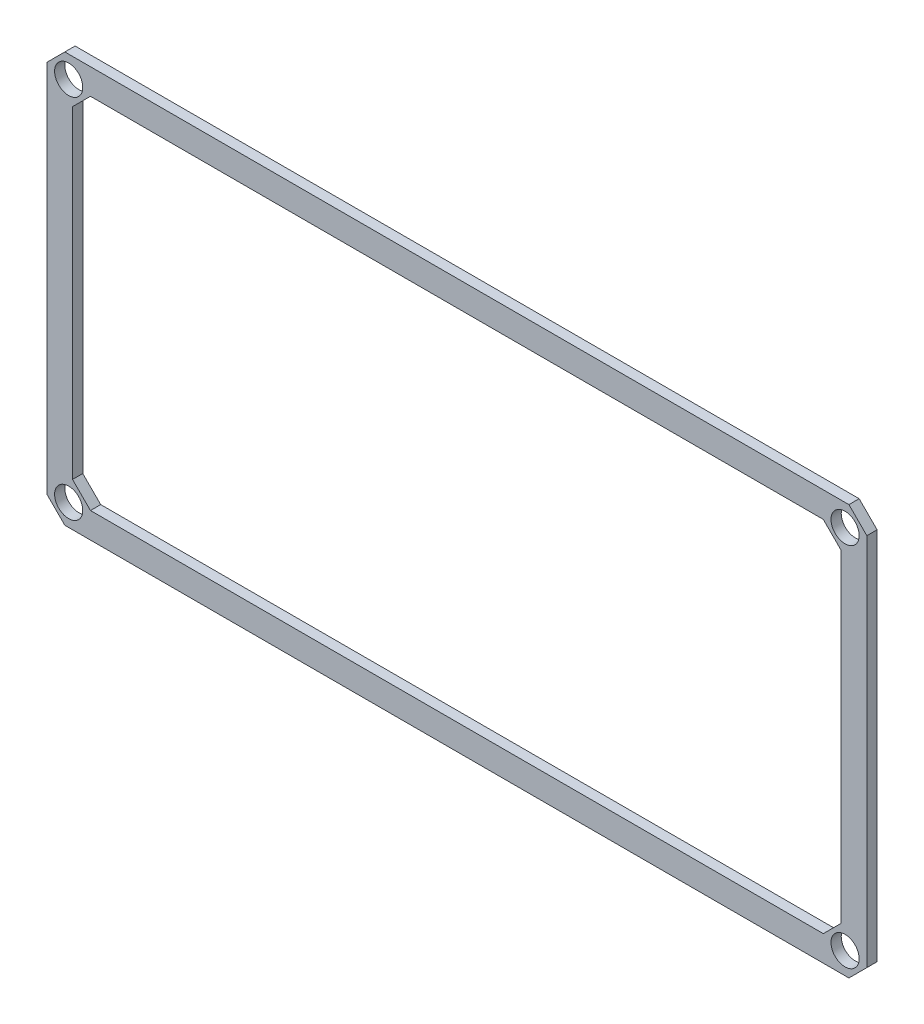
ISO-10303-21;
HEADER;
FILE_DESCRIPTION(('STEP AP214'),'2;1');
FILE_NAME('part.step','',(''),(''),'','','');
FILE_SCHEMA(('AUTOMOTIVE_DESIGN { 1 0 10303 214 1 1 1 1 }'));
ENDSEC;
DATA;
#1=APPLICATION_CONTEXT('core data for automotive mechanical design processes');
#2=APPLICATION_PROTOCOL_DEFINITION('international standard','automotive_design',2000,#1);
#3=PRODUCT_CONTEXT('',#1,'mechanical');
#4=PRODUCT('Part','Part','',(#3));
#5=PRODUCT_RELATED_PRODUCT_CATEGORY('part','',(#4));
#6=PRODUCT_DEFINITION_FORMATION('','',#4);
#7=PRODUCT_DEFINITION_CONTEXT('part definition',#1,'design');
#8=PRODUCT_DEFINITION('design','',#6,#7);
#9=PRODUCT_DEFINITION_SHAPE('','',#8);
#10=(LENGTH_UNIT() NAMED_UNIT(*) SI_UNIT(.MILLI.,.METRE.));
#11=(NAMED_UNIT(*) PLANE_ANGLE_UNIT() SI_UNIT($,.RADIAN.));
#12=(NAMED_UNIT(*) SI_UNIT($,.STERADIAN.) SOLID_ANGLE_UNIT());
#13=UNCERTAINTY_MEASURE_WITH_UNIT(LENGTH_MEASURE(1.E-05),#10,'distance_accuracy_value','');
#14=(GEOMETRIC_REPRESENTATION_CONTEXT(3) GLOBAL_UNCERTAINTY_ASSIGNED_CONTEXT((#13)) GLOBAL_UNIT_ASSIGNED_CONTEXT((#10,
#11,#12)) REPRESENTATION_CONTEXT('',''));
#15=CARTESIAN_POINT('',(0.,0.,0.));
#16=DIRECTION('',(0.,0.,1.));
#17=DIRECTION('',(1.,0.,0.));
#18=AXIS2_PLACEMENT_3D('',#15,#16,#17);
#19=CARTESIAN_POINT('',(0.,0.,2.));
#20=DIRECTION('',(0.,0.,-1.));
#21=DIRECTION('',(-1.,0.,0.));
#22=AXIS2_PLACEMENT_3D('',#19,#20,#21);
#23=PLANE('',#22);
#24=CARTESIAN_POINT('',(75.75,35.75,2.));
#25=DIRECTION('',(0.,0.,-1.));
#26=DIRECTION('',(-1.,0.,0.));
#27=AXIS2_PLACEMENT_3D('',#24,#25,#26);
#28=CIRCLE('',#27,2.75);
#29=CARTESIAN_POINT('',(73.,35.75,2.));
#30=VERTEX_POINT('',#29);
#31=EDGE_CURVE('E474',#30,#30,#28,.T.);
#32=ORIENTED_EDGE('',*,*,#31,.T.);
#33=EDGE_LOOP('',(#32));
#34=FACE_BOUND('',#33,.T.);
#35=CARTESIAN_POINT('',(-75.75,-35.75,2.));
#36=DIRECTION('',(0.,0.,-1.));
#37=DIRECTION('',(-1.,0.,0.));
#38=AXIS2_PLACEMENT_3D('',#35,#36,#37);
#39=CIRCLE('',#38,2.75);
#40=CARTESIAN_POINT('',(-78.5,-35.75,2.));
#41=VERTEX_POINT('',#40);
#42=EDGE_CURVE('E487',#41,#41,#39,.T.);
#43=ORIENTED_EDGE('',*,*,#42,.T.);
#44=EDGE_LOOP('',(#43));
#45=FACE_BOUND('',#44,.T.);
#46=CARTESIAN_POINT('',(-75.75,35.75,2.));
#47=DIRECTION('',(0.,0.,-1.));
#48=DIRECTION('',(-1.,0.,0.));
#49=AXIS2_PLACEMENT_3D('',#46,#47,#48);
#50=CIRCLE('',#49,2.75);
#51=CARTESIAN_POINT('',(-78.5,35.75,2.));
#52=VERTEX_POINT('',#51);
#53=EDGE_CURVE('E495',#52,#52,#50,.T.);
#54=ORIENTED_EDGE('',*,*,#53,.T.);
#55=EDGE_LOOP('',(#54));
#56=FACE_BOUND('',#55,.T.);
#57=CARTESIAN_POINT('',(75.75,-35.75,2.));
#58=DIRECTION('',(0.,0.,-1.));
#59=DIRECTION('',(-1.,0.,0.));
#60=AXIS2_PLACEMENT_3D('',#57,#58,#59);
#61=CIRCLE('',#60,2.75);
#62=CARTESIAN_POINT('',(73.,-35.75,2.));
#63=VERTEX_POINT('',#62);
#64=EDGE_CURVE('E324',#63,#63,#61,.T.);
#65=ORIENTED_EDGE('',*,*,#64,.T.);
#66=EDGE_LOOP('',(#65));
#67=FACE_BOUND('',#66,.T.);
#68=DIRECTION('',(1.,0.,0.));
#69=VECTOR('',#68,1.);
#70=CARTESIAN_POINT('',(-80.,-40.,2.));
#71=LINE('',#70,#69);
#72=CARTESIAN_POINT('',(-76.5,-40.,2.));
#73=VERTEX_POINT('',#72);
#74=CARTESIAN_POINT('',(76.5,-40.,2.));
#75=VERTEX_POINT('',#74);
#76=EDGE_CURVE('E200',#73,#75,#71,.T.);
#77=ORIENTED_EDGE('',*,*,#76,.T.);
#78=DIRECTION('',(-0.70710678118655,-0.707106781186545,0.));
#79=VECTOR('',#78,1.);
#80=CARTESIAN_POINT('',(80.,-36.5,2.));
#81=LINE('',#80,#79);
#82=CARTESIAN_POINT('',(80.,-36.5,2.));
#83=VERTEX_POINT('',#82);
#84=EDGE_CURVE('E231',#75,#83,#81,.F.);
#85=ORIENTED_EDGE('',*,*,#84,.T.);
#86=DIRECTION('',(0.,1.,0.));
#87=VECTOR('',#86,1.);
#88=CARTESIAN_POINT('',(80.,-40.,2.));
#89=LINE('',#88,#87);
#90=CARTESIAN_POINT('',(80.,36.5,2.));
#91=VERTEX_POINT('',#90);
#92=EDGE_CURVE('E178',#83,#91,#89,.T.);
#93=ORIENTED_EDGE('',*,*,#92,.T.);
#94=DIRECTION('',(0.707106781186545,-0.70710678118655,0.));
#95=VECTOR('',#94,1.);
#96=CARTESIAN_POINT('',(76.5,40.,2.));
#97=LINE('',#96,#95);
#98=CARTESIAN_POINT('',(76.5,40.,2.));
#99=VERTEX_POINT('',#98);
#100=EDGE_CURVE('E225',#91,#99,#97,.F.);
#101=ORIENTED_EDGE('',*,*,#100,.T.);
#102=DIRECTION('',(-1.,0.,0.));
#103=VECTOR('',#102,1.);
#104=CARTESIAN_POINT('',(-80.,40.,2.));
#105=LINE('',#104,#103);
#106=CARTESIAN_POINT('',(-76.5,40.,2.));
#107=VERTEX_POINT('',#106);
#108=EDGE_CURVE('E336',#99,#107,#105,.T.);
#109=ORIENTED_EDGE('',*,*,#108,.T.);
#110=DIRECTION('',(0.70710678118655,0.707106781186545,0.));
#111=VECTOR('',#110,1.);
#112=CARTESIAN_POINT('',(-80.,36.5,2.));
#113=LINE('',#112,#111);
#114=CARTESIAN_POINT('',(-80.,36.5,2.));
#115=VERTEX_POINT('',#114);
#116=EDGE_CURVE('E222',#107,#115,#113,.F.);
#117=ORIENTED_EDGE('',*,*,#116,.T.);
#118=DIRECTION('',(0.,-1.,0.));
#119=VECTOR('',#118,1.);
#120=CARTESIAN_POINT('',(-80.,-40.,2.));
#121=LINE('',#120,#119);
#122=CARTESIAN_POINT('',(-80.,-36.5,2.));
#123=VERTEX_POINT('',#122);
#124=EDGE_CURVE('E339',#115,#123,#121,.T.);
#125=ORIENTED_EDGE('',*,*,#124,.T.);
#126=DIRECTION('',(-0.707106781186545,0.70710678118655,0.));
#127=VECTOR('',#126,1.);
#128=CARTESIAN_POINT('',(-76.5,-40.,2.));
#129=LINE('',#128,#127);
#130=EDGE_CURVE('E228',#123,#73,#129,.F.);
#131=ORIENTED_EDGE('',*,*,#130,.T.);
#132=EDGE_LOOP('',(#77,#85,#93,#101,#109,#117,#125,#131));
#133=FACE_BOUND('',#132,.T.);
#134=DIRECTION('',(0.,-1.,0.));
#135=VECTOR('',#134,1.);
#136=CARTESIAN_POINT('',(-75.,-35.,2.));
#137=LINE('',#136,#135);
#138=CARTESIAN_POINT('',(-75.,31.5,2.));
#139=VERTEX_POINT('',#138);
#140=CARTESIAN_POINT('',(-75.,-31.5,2.));
#141=VERTEX_POINT('',#140);
#142=EDGE_CURVE('E309',#139,#141,#137,.T.);
#143=ORIENTED_EDGE('',*,*,#142,.F.);
#144=DIRECTION('',(-0.70710678118655,-0.707106781186545,0.));
#145=VECTOR('',#144,1.);
#146=CARTESIAN_POINT('',(-53.2499999999997,53.2500000000001,2.));
#147=LINE('',#146,#145);
#148=CARTESIAN_POINT('',(-71.5,35.,2.));
#149=VERTEX_POINT('',#148);
#150=EDGE_CURVE('E289',#139,#149,#147,.F.);
#151=ORIENTED_EDGE('',*,*,#150,.T.);
#152=DIRECTION('',(-1.,0.,0.));
#153=VECTOR('',#152,1.);
#154=CARTESIAN_POINT('',(-75.,35.,2.));
#155=LINE('',#154,#153);
#156=CARTESIAN_POINT('',(71.5,35.,2.));
#157=VERTEX_POINT('',#156);
#158=EDGE_CURVE('E189',#157,#149,#155,.T.);
#159=ORIENTED_EDGE('',*,*,#158,.F.);
#160=DIRECTION('',(-0.707106781186545,0.70710678118655,0.));
#161=VECTOR('',#160,1.);
#162=CARTESIAN_POINT('',(53.2500000000003,53.2499999999999,2.));
#163=LINE('',#162,#161);
#164=CARTESIAN_POINT('',(75.,31.5,2.));
#165=VERTEX_POINT('',#164);
#166=EDGE_CURVE('E283',#157,#165,#163,.F.);
#167=ORIENTED_EDGE('',*,*,#166,.T.);
#168=DIRECTION('',(0.,1.,0.));
#169=VECTOR('',#168,1.);
#170=CARTESIAN_POINT('',(75.,-35.,2.));
#171=LINE('',#170,#169);
#172=CARTESIAN_POINT('',(75.,-31.5,2.));
#173=VERTEX_POINT('',#172);
#174=EDGE_CURVE('E197',#173,#165,#171,.T.);
#175=ORIENTED_EDGE('',*,*,#174,.F.);
#176=DIRECTION('',(0.707106781186553,0.707106781186542,0.));
#177=VECTOR('',#176,1.);
#178=CARTESIAN_POINT('',(53.2499999999994,-53.2500000000003,2.));
#179=LINE('',#178,#177);
#180=CARTESIAN_POINT('',(71.5,-35.,2.));
#181=VERTEX_POINT('',#180);
#182=EDGE_CURVE('E58',#173,#181,#179,.F.);
#183=ORIENTED_EDGE('',*,*,#182,.T.);
#184=DIRECTION('',(1.,0.,0.));
#185=VECTOR('',#184,1.);
#186=CARTESIAN_POINT('',(-75.,-35.,2.));
#187=LINE('',#186,#185);
#188=CARTESIAN_POINT('',(-71.5,-35.,2.));
#189=VERTEX_POINT('',#188);
#190=EDGE_CURVE('E311',#189,#181,#187,.T.);
#191=ORIENTED_EDGE('',*,*,#190,.F.);
#192=DIRECTION('',(0.707106781186545,-0.70710678118655,0.));
#193=VECTOR('',#192,1.);
#194=CARTESIAN_POINT('',(-53.2500000000003,-53.2499999999999,2.));
#195=LINE('',#194,#193);
#196=EDGE_CURVE('E11',#189,#141,#195,.F.);
#197=ORIENTED_EDGE('',*,*,#196,.T.);
#198=EDGE_LOOP('',(#143,#151,#159,#167,#175,#183,#191,#197));
#199=FACE_BOUND('',#198,.T.);
#200=ADVANCED_FACE('F41',(#34,#45,#56,#67,#133,#199),#23,.F.);
#201=CARTESIAN_POINT('',(0.,0.,0.));
#202=DIRECTION('',(0.,0.,-1.));
#203=DIRECTION('',(-1.,0.,0.));
#204=AXIS2_PLACEMENT_3D('',#201,#202,#203);
#205=PLANE('',#204);
#206=CARTESIAN_POINT('',(75.75,35.75,0.));
#207=DIRECTION('',(0.,0.,-1.));
#208=DIRECTION('',(-1.,0.,0.));
#209=AXIS2_PLACEMENT_3D('',#206,#207,#208);
#210=CIRCLE('',#209,2.74999999999999);
#211=CARTESIAN_POINT('',(73.,35.75,0.));
#212=VERTEX_POINT('',#211);
#213=EDGE_CURVE('E477',#212,#212,#210,.T.);
#214=ORIENTED_EDGE('',*,*,#213,.F.);
#215=EDGE_LOOP('',(#214));
#216=FACE_BOUND('',#215,.T.);
#217=CARTESIAN_POINT('',(-75.75,-35.75,0.));
#218=DIRECTION('',(0.,0.,-1.));
#219=DIRECTION('',(-1.,0.,0.));
#220=AXIS2_PLACEMENT_3D('',#217,#218,#219);
#221=CIRCLE('',#220,2.74999999999999);
#222=CARTESIAN_POINT('',(-78.5,-35.75,0.));
#223=VERTEX_POINT('',#222);
#224=EDGE_CURVE('E481',#223,#223,#221,.T.);
#225=ORIENTED_EDGE('',*,*,#224,.F.);
#226=EDGE_LOOP('',(#225));
#227=FACE_BOUND('',#226,.T.);
#228=CARTESIAN_POINT('',(-75.75,35.75,0.));
#229=DIRECTION('',(0.,0.,-1.));
#230=DIRECTION('',(-1.,0.,0.));
#231=AXIS2_PLACEMENT_3D('',#228,#229,#230);
#232=CIRCLE('',#231,2.74999999999999);
#233=CARTESIAN_POINT('',(-78.5,35.75,0.));
#234=VERTEX_POINT('',#233);
#235=EDGE_CURVE('E491',#234,#234,#232,.T.);
#236=ORIENTED_EDGE('',*,*,#235,.F.);
#237=EDGE_LOOP('',(#236));
#238=FACE_BOUND('',#237,.T.);
#239=CARTESIAN_POINT('',(75.75,-35.75,0.));
#240=DIRECTION('',(0.,0.,-1.));
#241=DIRECTION('',(-1.,0.,0.));
#242=AXIS2_PLACEMENT_3D('',#239,#240,#241);
#243=CIRCLE('',#242,2.74999999999999);
#244=CARTESIAN_POINT('',(73.,-35.75,0.));
#245=VERTEX_POINT('',#244);
#246=EDGE_CURVE('E498',#245,#245,#243,.T.);
#247=ORIENTED_EDGE('',*,*,#246,.F.);
#248=EDGE_LOOP('',(#247));
#249=FACE_BOUND('',#248,.T.);
#250=DIRECTION('',(0.,1.,0.));
#251=VECTOR('',#250,1.);
#252=CARTESIAN_POINT('',(80.,-40.,0.));
#253=LINE('',#252,#251);
#254=CARTESIAN_POINT('',(80.,-36.5,0.));
#255=VERTEX_POINT('',#254);
#256=CARTESIAN_POINT('',(80.,36.5,0.));
#257=VERTEX_POINT('',#256);
#258=EDGE_CURVE('E175',#255,#257,#253,.T.);
#259=ORIENTED_EDGE('',*,*,#258,.F.);
#260=DIRECTION('',(0.70710678118655,0.707106781186545,0.));
#261=VECTOR('',#260,1.);
#262=CARTESIAN_POINT('',(58.2499999999997,-58.2500000000002,0.));
#263=LINE('',#262,#261);
#264=CARTESIAN_POINT('',(76.5,-40.,0.));
#265=VERTEX_POINT('',#264);
#266=EDGE_CURVE('E157',#255,#265,#263,.F.);
#267=ORIENTED_EDGE('',*,*,#266,.T.);
#268=DIRECTION('',(1.,0.,0.));
#269=VECTOR('',#268,1.);
#270=CARTESIAN_POINT('',(-80.,-40.,0.));
#271=LINE('',#270,#269);
#272=CARTESIAN_POINT('',(-76.5,-40.,0.));
#273=VERTEX_POINT('',#272);
#274=EDGE_CURVE('E206',#273,#265,#271,.T.);
#275=ORIENTED_EDGE('',*,*,#274,.F.);
#276=DIRECTION('',(0.707106781186545,-0.70710678118655,0.));
#277=VECTOR('',#276,1.);
#278=CARTESIAN_POINT('',(-58.2500000000003,-58.2499999999998,0.));
#279=LINE('',#278,#277);
#280=CARTESIAN_POINT('',(-80.,-36.5,0.));
#281=VERTEX_POINT('',#280);
#282=EDGE_CURVE('E169',#273,#281,#279,.F.);
#283=ORIENTED_EDGE('',*,*,#282,.T.);
#284=DIRECTION('',(0.,-1.,0.));
#285=VECTOR('',#284,1.);
#286=CARTESIAN_POINT('',(-80.,-40.,0.));
#287=LINE('',#286,#285);
#288=CARTESIAN_POINT('',(-80.,36.5,0.));
#289=VERTEX_POINT('',#288);
#290=EDGE_CURVE('E194',#289,#281,#287,.T.);
#291=ORIENTED_EDGE('',*,*,#290,.F.);
#292=DIRECTION('',(-0.70710678118655,-0.707106781186545,0.));
#293=VECTOR('',#292,1.);
#294=CARTESIAN_POINT('',(-58.2499999999997,58.2500000000001,0.));
#295=LINE('',#294,#293);
#296=CARTESIAN_POINT('',(-76.5,40.,0.));
#297=VERTEX_POINT('',#296);
#298=EDGE_CURVE('E180',#289,#297,#295,.F.);
#299=ORIENTED_EDGE('',*,*,#298,.T.);
#300=DIRECTION('',(-1.,0.,0.));
#301=VECTOR('',#300,1.);
#302=CARTESIAN_POINT('',(-80.,40.,0.));
#303=LINE('',#302,#301);
#304=CARTESIAN_POINT('',(76.5,40.,0.));
#305=VERTEX_POINT('',#304);
#306=EDGE_CURVE('E188',#305,#297,#303,.T.);
#307=ORIENTED_EDGE('',*,*,#306,.F.);
#308=DIRECTION('',(-0.707106781186545,0.70710678118655,0.));
#309=VECTOR('',#308,1.);
#310=CARTESIAN_POINT('',(58.2500000000003,58.2499999999999,0.));
#311=LINE('',#310,#309);
#312=EDGE_CURVE('E186',#305,#257,#311,.F.);
#313=ORIENTED_EDGE('',*,*,#312,.T.);
#314=EDGE_LOOP('',(#259,#267,#275,#283,#291,#299,#307,#313));
#315=FACE_BOUND('',#314,.T.);
#316=DIRECTION('',(0.,1.,0.));
#317=VECTOR('',#316,1.);
#318=CARTESIAN_POINT('',(75.,-35.,0.));
#319=LINE('',#318,#317);
#320=CARTESIAN_POINT('',(75.,-31.5,0.));
#321=VERTEX_POINT('',#320);
#322=CARTESIAN_POINT('',(75.,31.5,0.));
#323=VERTEX_POINT('',#322);
#324=EDGE_CURVE('E303',#321,#323,#319,.T.);
#325=ORIENTED_EDGE('',*,*,#324,.T.);
#326=DIRECTION('',(0.707106781186545,-0.70710678118655,0.));
#327=VECTOR('',#326,1.);
#328=CARTESIAN_POINT('',(75.,31.5,0.));
#329=LINE('',#328,#327);
#330=CARTESIAN_POINT('',(71.5,35.,0.));
#331=VERTEX_POINT('',#330);
#332=EDGE_CURVE('E280',#323,#331,#329,.F.);
#333=ORIENTED_EDGE('',*,*,#332,.T.);
#334=DIRECTION('',(-1.,0.,0.));
#335=VECTOR('',#334,1.);
#336=CARTESIAN_POINT('',(-75.,35.,0.));
#337=LINE('',#336,#335);
#338=CARTESIAN_POINT('',(-71.5,35.,0.));
#339=VERTEX_POINT('',#338);
#340=EDGE_CURVE('E316',#331,#339,#337,.T.);
#341=ORIENTED_EDGE('',*,*,#340,.T.);
#342=DIRECTION('',(0.70710678118655,0.707106781186545,0.));
#343=VECTOR('',#342,1.);
#344=CARTESIAN_POINT('',(-71.5,35.,0.));
#345=LINE('',#344,#343);
#346=CARTESIAN_POINT('',(-75.,31.5,0.));
#347=VERTEX_POINT('',#346);
#348=EDGE_CURVE('E286',#339,#347,#345,.F.);
#349=ORIENTED_EDGE('',*,*,#348,.T.);
#350=DIRECTION('',(0.,-1.,0.));
#351=VECTOR('',#350,1.);
#352=CARTESIAN_POINT('',(-75.,-35.,0.));
#353=LINE('',#352,#351);
#354=CARTESIAN_POINT('',(-75.,-31.5,0.));
#355=VERTEX_POINT('',#354);
#356=EDGE_CURVE('E297',#347,#355,#353,.T.);
#357=ORIENTED_EDGE('',*,*,#356,.T.);
#358=DIRECTION('',(-0.707106781186545,0.70710678118655,0.));
#359=VECTOR('',#358,1.);
#360=CARTESIAN_POINT('',(-75.,-31.5,0.));
#361=LINE('',#360,#359);
#362=CARTESIAN_POINT('',(-71.5,-35.,0.));
#363=VERTEX_POINT('',#362);
#364=EDGE_CURVE('E51',#355,#363,#361,.F.);
#365=ORIENTED_EDGE('',*,*,#364,.T.);
#366=DIRECTION('',(1.,0.,0.));
#367=VECTOR('',#366,1.);
#368=CARTESIAN_POINT('',(-75.,-35.,0.));
#369=LINE('',#368,#367);
#370=CARTESIAN_POINT('',(71.5,-35.,0.));
#371=VERTEX_POINT('',#370);
#372=EDGE_CURVE('E295',#363,#371,#369,.T.);
#373=ORIENTED_EDGE('',*,*,#372,.T.);
#374=DIRECTION('',(-0.707106781186553,-0.707106781186542,0.));
#375=VECTOR('',#374,1.);
#376=CARTESIAN_POINT('',(71.5,-35.,0.));
#377=LINE('',#376,#375);
#378=EDGE_CURVE('E275',#371,#321,#377,.F.);
#379=ORIENTED_EDGE('',*,*,#378,.T.);
#380=EDGE_LOOP('',(#325,#333,#341,#349,#357,#365,#373,#379));
#381=FACE_BOUND('',#380,.T.);
#382=ADVANCED_FACE('F183',(#216,#227,#238,#249,#315,#381),#205,.T.);
#383=CARTESIAN_POINT('',(80.,-40.,2.));
#384=DIRECTION('',(-1.,0.,0.));
#385=DIRECTION('',(0.,0.,1.));
#386=AXIS2_PLACEMENT_3D('',#383,#384,#385);
#387=PLANE('',#386);
#388=ORIENTED_EDGE('',*,*,#92,.F.);
#389=DIRECTION('',(0.,0.,-1.));
#390=VECTOR('',#389,1.);
#391=CARTESIAN_POINT('',(80.,-36.5,2.));
#392=LINE('',#391,#390);
#393=EDGE_CURVE('E161',#83,#255,#392,.T.);
#394=ORIENTED_EDGE('',*,*,#393,.T.);
#395=ORIENTED_EDGE('',*,*,#258,.T.);
#396=DIRECTION('',(0.,0.,1.));
#397=VECTOR('',#396,1.);
#398=CARTESIAN_POINT('',(80.,36.5,2.));
#399=LINE('',#398,#397);
#400=EDGE_CURVE('E181',#257,#91,#399,.T.);
#401=ORIENTED_EDGE('',*,*,#400,.T.);
#402=EDGE_LOOP('',(#388,#394,#395,#401));
#403=FACE_BOUND('',#402,.T.);
#404=ADVANCED_FACE('F174',(#403),#387,.F.);
#405=CARTESIAN_POINT('',(-80.,40.,2.));
#406=DIRECTION('',(0.,-1.,0.));
#407=DIRECTION('',(0.,0.,-1.));
#408=AXIS2_PLACEMENT_3D('',#405,#406,#407);
#409=PLANE('',#408);
#410=ORIENTED_EDGE('',*,*,#108,.F.);
#411=DIRECTION('',(0.,0.,-1.));
#412=VECTOR('',#411,1.);
#413=CARTESIAN_POINT('',(76.5,40.,2.));
#414=LINE('',#413,#412);
#415=EDGE_CURVE('E271',#99,#305,#414,.T.);
#416=ORIENTED_EDGE('',*,*,#415,.T.);
#417=ORIENTED_EDGE('',*,*,#306,.T.);
#418=DIRECTION('',(0.,0.,1.));
#419=VECTOR('',#418,1.);
#420=CARTESIAN_POINT('',(-76.5,40.,2.));
#421=LINE('',#420,#419);
#422=EDGE_CURVE('E268',#297,#107,#421,.T.);
#423=ORIENTED_EDGE('',*,*,#422,.T.);
#424=EDGE_LOOP('',(#410,#416,#417,#423));
#425=FACE_BOUND('',#424,.T.);
#426=ADVANCED_FACE('F363',(#425),#409,.F.);
#427=CARTESIAN_POINT('',(-80.,-40.,2.));
#428=DIRECTION('',(1.,0.,0.));
#429=DIRECTION('',(0.,0.,-1.));
#430=AXIS2_PLACEMENT_3D('',#427,#428,#429);
#431=PLANE('',#430);
#432=ORIENTED_EDGE('',*,*,#290,.T.);
#433=DIRECTION('',(0.,0.,1.));
#434=VECTOR('',#433,1.);
#435=CARTESIAN_POINT('',(-80.,-36.5,2.));
#436=LINE('',#435,#434);
#437=EDGE_CURVE('E238',#281,#123,#436,.T.);
#438=ORIENTED_EDGE('',*,*,#437,.T.);
#439=ORIENTED_EDGE('',*,*,#124,.F.);
#440=DIRECTION('',(0.,0.,-1.));
#441=VECTOR('',#440,1.);
#442=CARTESIAN_POINT('',(-80.,36.5,2.));
#443=LINE('',#442,#441);
#444=EDGE_CURVE('E234',#115,#289,#443,.T.);
#445=ORIENTED_EDGE('',*,*,#444,.T.);
#446=EDGE_LOOP('',(#432,#438,#439,#445));
#447=FACE_BOUND('',#446,.T.);
#448=ADVANCED_FACE('F356',(#447),#431,.F.);
#449=CARTESIAN_POINT('',(-80.,-40.,2.));
#450=DIRECTION('',(0.,1.,0.));
#451=DIRECTION('',(0.,0.,1.));
#452=AXIS2_PLACEMENT_3D('',#449,#450,#451);
#453=PLANE('',#452);
#454=ORIENTED_EDGE('',*,*,#274,.T.);
#455=DIRECTION('',(0.,0.,1.));
#456=VECTOR('',#455,1.);
#457=CARTESIAN_POINT('',(76.5,-40.,2.));
#458=LINE('',#457,#456);
#459=EDGE_CURVE('E162',#265,#75,#458,.T.);
#460=ORIENTED_EDGE('',*,*,#459,.T.);
#461=ORIENTED_EDGE('',*,*,#76,.F.);
#462=DIRECTION('',(0.,0.,-1.));
#463=VECTOR('',#462,1.);
#464=CARTESIAN_POINT('',(-76.5,-40.,2.));
#465=LINE('',#464,#463);
#466=EDGE_CURVE('E168',#73,#273,#465,.T.);
#467=ORIENTED_EDGE('',*,*,#466,.T.);
#468=EDGE_LOOP('',(#454,#460,#461,#467));
#469=FACE_BOUND('',#468,.T.);
#470=ADVANCED_FACE('F350',(#469),#453,.F.);
#471=CARTESIAN_POINT('',(-75.,-35.,2.));
#472=DIRECTION('',(1.,0.,0.));
#473=DIRECTION('',(0.,0.,-1.));
#474=AXIS2_PLACEMENT_3D('',#471,#472,#473);
#475=PLANE('',#474);
#476=ORIENTED_EDGE('',*,*,#356,.F.);
#477=DIRECTION('',(0.,0.,1.));
#478=VECTOR('',#477,1.);
#479=CARTESIAN_POINT('',(-75.,31.5,2.));
#480=LINE('',#479,#478);
#481=EDGE_CURVE('E265',#347,#139,#480,.T.);
#482=ORIENTED_EDGE('',*,*,#481,.T.);
#483=ORIENTED_EDGE('',*,*,#142,.T.);
#484=DIRECTION('',(0.,0.,-1.));
#485=VECTOR('',#484,1.);
#486=CARTESIAN_POINT('',(-75.,-31.5,0.));
#487=LINE('',#486,#485);
#488=EDGE_CURVE('E261',#141,#355,#487,.T.);
#489=ORIENTED_EDGE('',*,*,#488,.T.);
#490=EDGE_LOOP('',(#476,#482,#483,#489));
#491=FACE_BOUND('',#490,.T.);
#492=ADVANCED_FACE('F313',(#491),#475,.T.);
#493=CARTESIAN_POINT('',(-75.,-35.,2.));
#494=DIRECTION('',(0.,1.,0.));
#495=DIRECTION('',(0.,0.,1.));
#496=AXIS2_PLACEMENT_3D('',#493,#494,#495);
#497=PLANE('',#496);
#498=ORIENTED_EDGE('',*,*,#190,.T.);
#499=DIRECTION('',(0.,0.,-1.));
#500=VECTOR('',#499,1.);
#501=CARTESIAN_POINT('',(71.5,-35.,0.));
#502=LINE('',#501,#500);
#503=EDGE_CURVE('E243',#181,#371,#502,.T.);
#504=ORIENTED_EDGE('',*,*,#503,.T.);
#505=ORIENTED_EDGE('',*,*,#372,.F.);
#506=DIRECTION('',(0.,0.,1.));
#507=VECTOR('',#506,1.);
#508=CARTESIAN_POINT('',(-71.5,-35.,2.));
#509=LINE('',#508,#507);
#510=EDGE_CURVE('E65',#363,#189,#509,.T.);
#511=ORIENTED_EDGE('',*,*,#510,.T.);
#512=EDGE_LOOP('',(#498,#504,#505,#511));
#513=FACE_BOUND('',#512,.T.);
#514=ADVANCED_FACE('F300',(#513),#497,.T.);
#515=CARTESIAN_POINT('',(75.,-35.,2.));
#516=DIRECTION('',(-1.,0.,0.));
#517=DIRECTION('',(0.,0.,1.));
#518=AXIS2_PLACEMENT_3D('',#515,#516,#517);
#519=PLANE('',#518);
#520=ORIENTED_EDGE('',*,*,#324,.F.);
#521=DIRECTION('',(0.,0.,1.));
#522=VECTOR('',#521,1.);
#523=CARTESIAN_POINT('',(75.,-31.5,2.));
#524=LINE('',#523,#522);
#525=EDGE_CURVE('E251',#321,#173,#524,.T.);
#526=ORIENTED_EDGE('',*,*,#525,.T.);
#527=ORIENTED_EDGE('',*,*,#174,.T.);
#528=DIRECTION('',(0.,0.,-1.));
#529=VECTOR('',#528,1.);
#530=CARTESIAN_POINT('',(75.,31.5,0.));
#531=LINE('',#530,#529);
#532=EDGE_CURVE('E247',#165,#323,#531,.T.);
#533=ORIENTED_EDGE('',*,*,#532,.T.);
#534=EDGE_LOOP('',(#520,#526,#527,#533));
#535=FACE_BOUND('',#534,.T.);
#536=ADVANCED_FACE('F446',(#535),#519,.T.);
#537=CARTESIAN_POINT('',(-75.,35.,2.));
#538=DIRECTION('',(0.,-1.,0.));
#539=DIRECTION('',(0.,0.,-1.));
#540=AXIS2_PLACEMENT_3D('',#537,#538,#539);
#541=PLANE('',#540);
#542=ORIENTED_EDGE('',*,*,#340,.F.);
#543=DIRECTION('',(0.,0.,1.));
#544=VECTOR('',#543,1.);
#545=CARTESIAN_POINT('',(71.5,35.,2.));
#546=LINE('',#545,#544);
#547=EDGE_CURVE('E258',#331,#157,#546,.T.);
#548=ORIENTED_EDGE('',*,*,#547,.T.);
#549=ORIENTED_EDGE('',*,*,#158,.T.);
#550=DIRECTION('',(0.,0.,-1.));
#551=VECTOR('',#550,1.);
#552=CARTESIAN_POINT('',(-71.5,35.,0.));
#553=LINE('',#552,#551);
#554=EDGE_CURVE('E254',#149,#339,#553,.T.);
#555=ORIENTED_EDGE('',*,*,#554,.T.);
#556=EDGE_LOOP('',(#542,#548,#549,#555));
#557=FACE_BOUND('',#556,.T.);
#558=ADVANCED_FACE('F404',(#557),#541,.T.);
#559=CARTESIAN_POINT('',(80.,-36.5,2.));
#560=DIRECTION('',(-0.707106781186545,0.70710678118655,0.));
#561=DIRECTION('',(0.,0.,-1.));
#562=AXIS2_PLACEMENT_3D('',#559,#560,#561);
#563=PLANE('',#562);
#564=ORIENTED_EDGE('',*,*,#84,.F.);
#565=ORIENTED_EDGE('',*,*,#459,.F.);
#566=ORIENTED_EDGE('',*,*,#266,.F.);
#567=ORIENTED_EDGE('',*,*,#393,.F.);
#568=EDGE_LOOP('',(#564,#565,#566,#567));
#569=FACE_BOUND('',#568,.T.);
#570=ADVANCED_FACE('F160',(#569),#563,.F.);
#571=CARTESIAN_POINT('',(-76.5,-40.,2.));
#572=DIRECTION('',(0.70710678118655,0.707106781186545,0.));
#573=DIRECTION('',(0.,0.,-1.));
#574=AXIS2_PLACEMENT_3D('',#571,#572,#573);
#575=PLANE('',#574);
#576=ORIENTED_EDGE('',*,*,#130,.F.);
#577=ORIENTED_EDGE('',*,*,#437,.F.);
#578=ORIENTED_EDGE('',*,*,#282,.F.);
#579=ORIENTED_EDGE('',*,*,#466,.F.);
#580=EDGE_LOOP('',(#576,#577,#578,#579));
#581=FACE_BOUND('',#580,.T.);
#582=ADVANCED_FACE('F352',(#581),#575,.F.);
#583=CARTESIAN_POINT('',(71.5,-35.,2.));
#584=DIRECTION('',(-0.707106781186542,0.707106781186553,0.));
#585=DIRECTION('',(0.,0.,1.));
#586=AXIS2_PLACEMENT_3D('',#583,#584,#585);
#587=PLANE('',#586);
#588=ORIENTED_EDGE('',*,*,#182,.F.);
#589=ORIENTED_EDGE('',*,*,#525,.F.);
#590=ORIENTED_EDGE('',*,*,#378,.F.);
#591=ORIENTED_EDGE('',*,*,#503,.F.);
#592=EDGE_LOOP('',(#588,#589,#590,#591));
#593=FACE_BOUND('',#592,.T.);
#594=ADVANCED_FACE('F410',(#593),#587,.T.);
#595=CARTESIAN_POINT('',(75.,31.5,2.));
#596=DIRECTION('',(-0.70710678118655,-0.707106781186545,0.));
#597=DIRECTION('',(0.,0.,1.));
#598=AXIS2_PLACEMENT_3D('',#595,#596,#597);
#599=PLANE('',#598);
#600=ORIENTED_EDGE('',*,*,#166,.F.);
#601=ORIENTED_EDGE('',*,*,#547,.F.);
#602=ORIENTED_EDGE('',*,*,#332,.F.);
#603=ORIENTED_EDGE('',*,*,#532,.F.);
#604=EDGE_LOOP('',(#600,#601,#602,#603));
#605=FACE_BOUND('',#604,.T.);
#606=ADVANCED_FACE('F416',(#605),#599,.T.);
#607=CARTESIAN_POINT('',(-71.5,35.,2.));
#608=DIRECTION('',(0.707106781186545,-0.70710678118655,0.));
#609=DIRECTION('',(0.,0.,1.));
#610=AXIS2_PLACEMENT_3D('',#607,#608,#609);
#611=PLANE('',#610);
#612=ORIENTED_EDGE('',*,*,#150,.F.);
#613=ORIENTED_EDGE('',*,*,#481,.F.);
#614=ORIENTED_EDGE('',*,*,#348,.F.);
#615=ORIENTED_EDGE('',*,*,#554,.F.);
#616=EDGE_LOOP('',(#612,#613,#614,#615));
#617=FACE_BOUND('',#616,.T.);
#618=ADVANCED_FACE('F374',(#617),#611,.T.);
#619=CARTESIAN_POINT('',(-75.,-31.5,2.));
#620=DIRECTION('',(0.70710678118655,0.707106781186545,0.));
#621=DIRECTION('',(0.,0.,1.));
#622=AXIS2_PLACEMENT_3D('',#619,#620,#621);
#623=PLANE('',#622);
#624=ORIENTED_EDGE('',*,*,#196,.F.);
#625=ORIENTED_EDGE('',*,*,#510,.F.);
#626=ORIENTED_EDGE('',*,*,#364,.F.);
#627=ORIENTED_EDGE('',*,*,#488,.F.);
#628=EDGE_LOOP('',(#624,#625,#626,#627));
#629=FACE_BOUND('',#628,.T.);
#630=ADVANCED_FACE('F306',(#629),#623,.T.);
#631=CARTESIAN_POINT('',(76.5,40.,2.));
#632=DIRECTION('',(-0.70710678118655,-0.707106781186545,0.));
#633=DIRECTION('',(0.,0.,-1.));
#634=AXIS2_PLACEMENT_3D('',#631,#632,#633);
#635=PLANE('',#634);
#636=ORIENTED_EDGE('',*,*,#100,.F.);
#637=ORIENTED_EDGE('',*,*,#400,.F.);
#638=ORIENTED_EDGE('',*,*,#312,.F.);
#639=ORIENTED_EDGE('',*,*,#415,.F.);
#640=EDGE_LOOP('',(#636,#637,#638,#639));
#641=FACE_BOUND('',#640,.T.);
#642=ADVANCED_FACE('F367',(#641),#635,.F.);
#643=CARTESIAN_POINT('',(-80.,36.5,2.));
#644=DIRECTION('',(0.707106781186545,-0.70710678118655,0.));
#645=DIRECTION('',(0.,0.,-1.));
#646=AXIS2_PLACEMENT_3D('',#643,#644,#645);
#647=PLANE('',#646);
#648=ORIENTED_EDGE('',*,*,#116,.F.);
#649=ORIENTED_EDGE('',*,*,#422,.F.);
#650=ORIENTED_EDGE('',*,*,#298,.F.);
#651=ORIENTED_EDGE('',*,*,#444,.F.);
#652=EDGE_LOOP('',(#648,#649,#650,#651));
#653=FACE_BOUND('',#652,.T.);
#654=ADVANCED_FACE('F44',(#653),#647,.F.);
#655=CARTESIAN_POINT('',(75.75,-35.75,0.));
#656=DIRECTION('',(0.,0.,-1.));
#657=DIRECTION('',(-1.,0.,0.));
#658=AXIS2_PLACEMENT_3D('',#655,#656,#657);
#659=CYLINDRICAL_SURFACE('',#658,2.75);
#660=ORIENTED_EDGE('',*,*,#64,.F.);
#661=EDGE_LOOP('',(#660));
#662=FACE_BOUND('',#661,.T.);
#663=ORIENTED_EDGE('',*,*,#246,.T.);
#664=EDGE_LOOP('',(#663));
#665=FACE_BOUND('',#664,.T.);
#666=ADVANCED_FACE('F373',(#662,#665),#659,.F.);
#667=CARTESIAN_POINT('',(-75.75,35.75,0.));
#668=DIRECTION('',(0.,0.,-1.));
#669=DIRECTION('',(-1.,0.,0.));
#670=AXIS2_PLACEMENT_3D('',#667,#668,#669);
#671=CYLINDRICAL_SURFACE('',#670,2.75);
#672=ORIENTED_EDGE('',*,*,#53,.F.);
#673=EDGE_LOOP('',(#672));
#674=FACE_BOUND('',#673,.T.);
#675=ORIENTED_EDGE('',*,*,#235,.T.);
#676=EDGE_LOOP('',(#675));
#677=FACE_BOUND('',#676,.T.);
#678=ADVANCED_FACE('F458',(#674,#677),#671,.F.);
#679=CARTESIAN_POINT('',(-75.75,-35.75,0.));
#680=DIRECTION('',(0.,0.,-1.));
#681=DIRECTION('',(-1.,0.,0.));
#682=AXIS2_PLACEMENT_3D('',#679,#680,#681);
#683=CYLINDRICAL_SURFACE('',#682,2.75);
#684=ORIENTED_EDGE('',*,*,#42,.F.);
#685=EDGE_LOOP('',(#684));
#686=FACE_BOUND('',#685,.T.);
#687=ORIENTED_EDGE('',*,*,#224,.T.);
#688=EDGE_LOOP('',(#687));
#689=FACE_BOUND('',#688,.T.);
#690=ADVANCED_FACE('F462',(#686,#689),#683,.F.);
#691=CARTESIAN_POINT('',(75.75,35.75,0.));
#692=DIRECTION('',(0.,0.,-1.));
#693=DIRECTION('',(-1.,0.,0.));
#694=AXIS2_PLACEMENT_3D('',#691,#692,#693);
#695=CYLINDRICAL_SURFACE('',#694,2.75);
#696=ORIENTED_EDGE('',*,*,#31,.F.);
#697=EDGE_LOOP('',(#696));
#698=FACE_BOUND('',#697,.T.);
#699=ORIENTED_EDGE('',*,*,#213,.T.);
#700=EDGE_LOOP('',(#699));
#701=FACE_BOUND('',#700,.T.);
#702=ADVANCED_FACE('F466',(#698,#701),#695,.F.);
#703=CLOSED_SHELL('',(#200,#382,#404,#426,#448,#470,#492,#514,#536,#558,#570,#582,#594,#606,
#618,#630,#642,#654,#666,#678,#690,#702));
#704=MANIFOLD_SOLID_BREP('B2',#703);
#705=ADVANCED_BREP_SHAPE_REPRESENTATION('',(#18,#704),#14);
#706=SHAPE_DEFINITION_REPRESENTATION(#9,#705);
ENDSEC;
END-ISO-10303-21;
